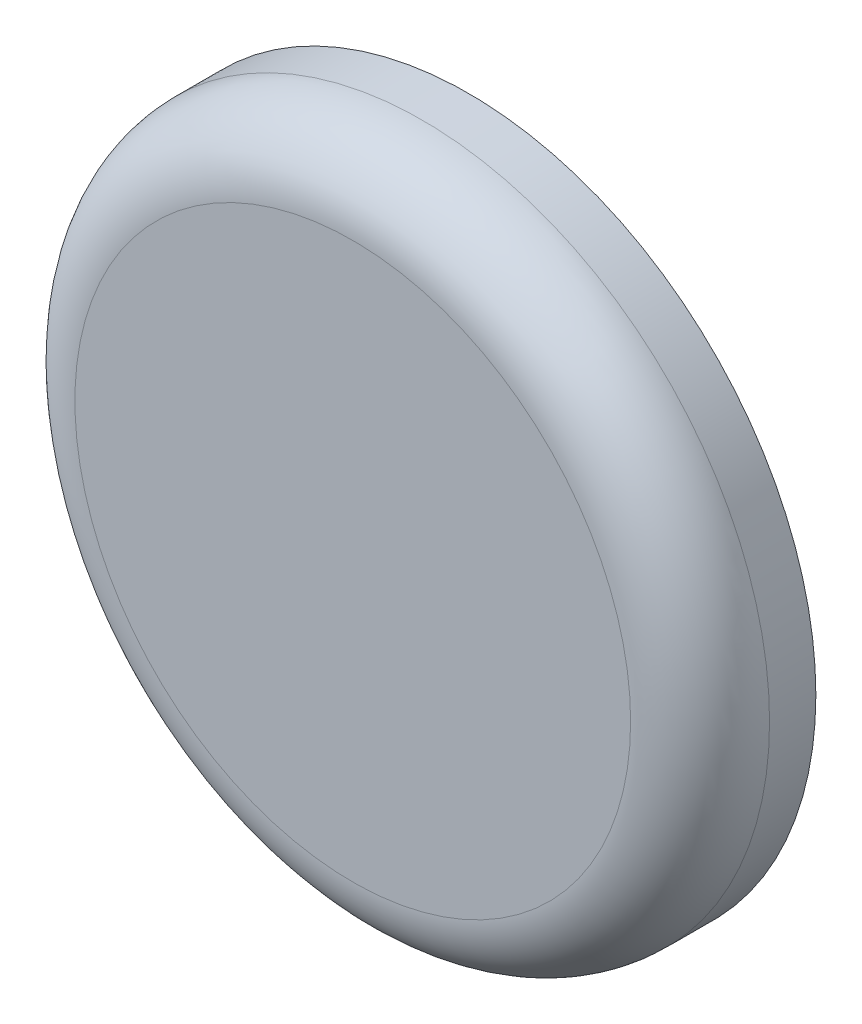
ISO-10303-21;
HEADER;
FILE_DESCRIPTION(('STEP AP214'),'2;1');
FILE_NAME('part.step','',(''),(''),'','','');
FILE_SCHEMA(('AUTOMOTIVE_DESIGN { 1 0 10303 214 1 1 1 1 }'));
ENDSEC;
DATA;
#1=APPLICATION_CONTEXT('core data for automotive mechanical design processes');
#2=APPLICATION_PROTOCOL_DEFINITION('international standard','automotive_design',2000,#1);
#3=PRODUCT_CONTEXT('',#1,'mechanical');
#4=PRODUCT('Part','Part','',(#3));
#5=PRODUCT_RELATED_PRODUCT_CATEGORY('part','',(#4));
#6=PRODUCT_DEFINITION_FORMATION('','',#4);
#7=PRODUCT_DEFINITION_CONTEXT('part definition',#1,'design');
#8=PRODUCT_DEFINITION('design','',#6,#7);
#9=PRODUCT_DEFINITION_SHAPE('','',#8);
#10=(LENGTH_UNIT() NAMED_UNIT(*) SI_UNIT(.MILLI.,.METRE.));
#11=(NAMED_UNIT(*) PLANE_ANGLE_UNIT() SI_UNIT($,.RADIAN.));
#12=(NAMED_UNIT(*) SI_UNIT($,.STERADIAN.) SOLID_ANGLE_UNIT());
#13=UNCERTAINTY_MEASURE_WITH_UNIT(LENGTH_MEASURE(1.E-05),#10,'distance_accuracy_value','');
#14=(GEOMETRIC_REPRESENTATION_CONTEXT(3) GLOBAL_UNCERTAINTY_ASSIGNED_CONTEXT((#13)) GLOBAL_UNIT_ASSIGNED_CONTEXT((#10,
#11,#12)) REPRESENTATION_CONTEXT('',''));
#15=CARTESIAN_POINT('',(0.,0.,0.));
#16=DIRECTION('',(0.,0.,1.));
#17=DIRECTION('',(1.,0.,0.));
#18=AXIS2_PLACEMENT_3D('',#15,#16,#17);
#19=CARTESIAN_POINT('',(0.,0.,5.));
#20=DIRECTION('',(0.,0.,-1.));
#21=DIRECTION('',(-1.,0.,0.));
#22=AXIS2_PLACEMENT_3D('',#19,#20,#21);
#23=CYLINDRICAL_SURFACE('',#22,15.);
#24=CARTESIAN_POINT('',(0.,0.,2.));
#25=DIRECTION('',(0.,0.,1.));
#26=DIRECTION('',(1.,0.,0.));
#27=AXIS2_PLACEMENT_3D('',#24,#25,#26);
#28=CIRCLE('',#27,15.);
#29=CARTESIAN_POINT('',(15.,0.,2.));
#30=VERTEX_POINT('',#29);
#31=EDGE_CURVE('E10',#30,#30,#28,.F.);
#32=ORIENTED_EDGE('',*,*,#31,.T.);
#33=EDGE_LOOP('',(#32));
#34=FACE_BOUND('',#33,.T.);
#35=CARTESIAN_POINT('',(0.,0.,0.));
#36=DIRECTION('',(0.,0.,1.));
#37=DIRECTION('',(1.,0.,0.));
#38=AXIS2_PLACEMENT_3D('',#35,#36,#37);
#39=CIRCLE('',#38,15.);
#40=CARTESIAN_POINT('',(15.,0.,0.));
#41=VERTEX_POINT('',#40);
#42=EDGE_CURVE('E48',#41,#41,#39,.T.);
#43=ORIENTED_EDGE('',*,*,#42,.T.);
#44=EDGE_LOOP('',(#43));
#45=FACE_BOUND('',#44,.T.);
#46=ADVANCED_FACE('F40',(#34,#45),#23,.T.);
#47=CARTESIAN_POINT('',(0.,0.,5.));
#48=DIRECTION('',(0.,0.,1.));
#49=DIRECTION('',(1.,0.,0.));
#50=AXIS2_PLACEMENT_3D('',#47,#48,#49);
#51=PLANE('',#50);
#52=CARTESIAN_POINT('',(0.,0.,5.));
#53=DIRECTION('',(0.,0.,1.));
#54=DIRECTION('',(1.,0.,0.));
#55=AXIS2_PLACEMENT_3D('',#52,#53,#54);
#56=CIRCLE('',#55,12.);
#57=CARTESIAN_POINT('',(12.,0.,5.));
#58=VERTEX_POINT('',#57);
#59=EDGE_CURVE('E42',#58,#58,#56,.T.);
#60=ORIENTED_EDGE('',*,*,#59,.T.);
#61=EDGE_LOOP('',(#60));
#62=FACE_BOUND('',#61,.T.);
#63=ADVANCED_FACE('F75',(#62),#51,.T.);
#64=CARTESIAN_POINT('',(0.,0.,0.));
#65=DIRECTION('',(0.,0.,1.));
#66=DIRECTION('',(1.,0.,0.));
#67=AXIS2_PLACEMENT_3D('',#64,#65,#66);
#68=PLANE('',#67);
#69=CARTESIAN_POINT('',(0.,0.,0.));
#70=DIRECTION('',(0.,0.,-1.));
#71=DIRECTION('',(-1.,0.,0.));
#72=AXIS2_PLACEMENT_3D('',#69,#70,#71);
#73=CIRCLE('',#72,1.8);
#74=CARTESIAN_POINT('',(-1.8,0.,0.));
#75=VERTEX_POINT('',#74);
#76=EDGE_CURVE('E54',#75,#75,#73,.T.);
#77=ORIENTED_EDGE('',*,*,#76,.F.);
#78=EDGE_LOOP('',(#77));
#79=FACE_BOUND('',#78,.T.);
#80=ORIENTED_EDGE('',*,*,#42,.F.);
#81=EDGE_LOOP('',(#80));
#82=FACE_BOUND('',#81,.T.);
#83=ADVANCED_FACE('F69',(#79,#82),#68,.F.);
#84=CARTESIAN_POINT('',(0.,0.,2.));
#85=DIRECTION('',(0.,0.,1.));
#86=DIRECTION('',(1.,0.,0.));
#87=AXIS2_PLACEMENT_3D('',#84,#85,#86);
#88=TOROIDAL_SURFACE('',#87,12.,3.);
#89=ORIENTED_EDGE('',*,*,#31,.F.);
#90=EDGE_LOOP('',(#89));
#91=FACE_BOUND('',#90,.T.);
#92=ORIENTED_EDGE('',*,*,#59,.F.);
#93=EDGE_LOOP('',(#92));
#94=FACE_BOUND('',#93,.T.);
#95=ADVANCED_FACE('F39',(#91,#94),#88,.T.);
#96=CARTESIAN_POINT('',(0.,0.,2.2));
#97=DIRECTION('',(0.,0.,-1.));
#98=DIRECTION('',(-1.,0.,0.));
#99=AXIS2_PLACEMENT_3D('',#96,#97,#98);
#100=CYLINDRICAL_SURFACE('',#99,1.8);
#101=CARTESIAN_POINT('',(0.,0.,2.2));
#102=DIRECTION('',(0.,0.,-1.));
#103=DIRECTION('',(-1.,0.,0.));
#104=AXIS2_PLACEMENT_3D('',#101,#102,#103);
#105=CIRCLE('',#104,1.8);
#106=CARTESIAN_POINT('',(-1.8,0.,2.2));
#107=VERTEX_POINT('',#106);
#108=EDGE_CURVE('E55',#107,#107,#105,.T.);
#109=ORIENTED_EDGE('',*,*,#108,.F.);
#110=EDGE_LOOP('',(#109));
#111=FACE_BOUND('',#110,.T.);
#112=ORIENTED_EDGE('',*,*,#76,.T.);
#113=EDGE_LOOP('',(#112));
#114=FACE_BOUND('',#113,.T.);
#115=ADVANCED_FACE('F62',(#111,#114),#100,.F.);
#116=CARTESIAN_POINT('',(0.,0.,2.2));
#117=DIRECTION('',(0.,0.,-1.));
#118=DIRECTION('',(-1.,0.,0.));
#119=AXIS2_PLACEMENT_3D('',#116,#117,#118);
#120=PLANE('',#119);
#121=ORIENTED_EDGE('',*,*,#108,.T.);
#122=EDGE_LOOP('',(#121));
#123=FACE_BOUND('',#122,.T.);
#124=ADVANCED_FACE('F61',(#123),#120,.T.);
#125=CLOSED_SHELL('',(#46,#63,#83,#95,#115,#124));
#126=MANIFOLD_SOLID_BREP('B2',#125);
#127=ADVANCED_BREP_SHAPE_REPRESENTATION('',(#18,#126),#14);
#128=SHAPE_DEFINITION_REPRESENTATION(#9,#127);
ENDSEC;
END-ISO-10303-21;
